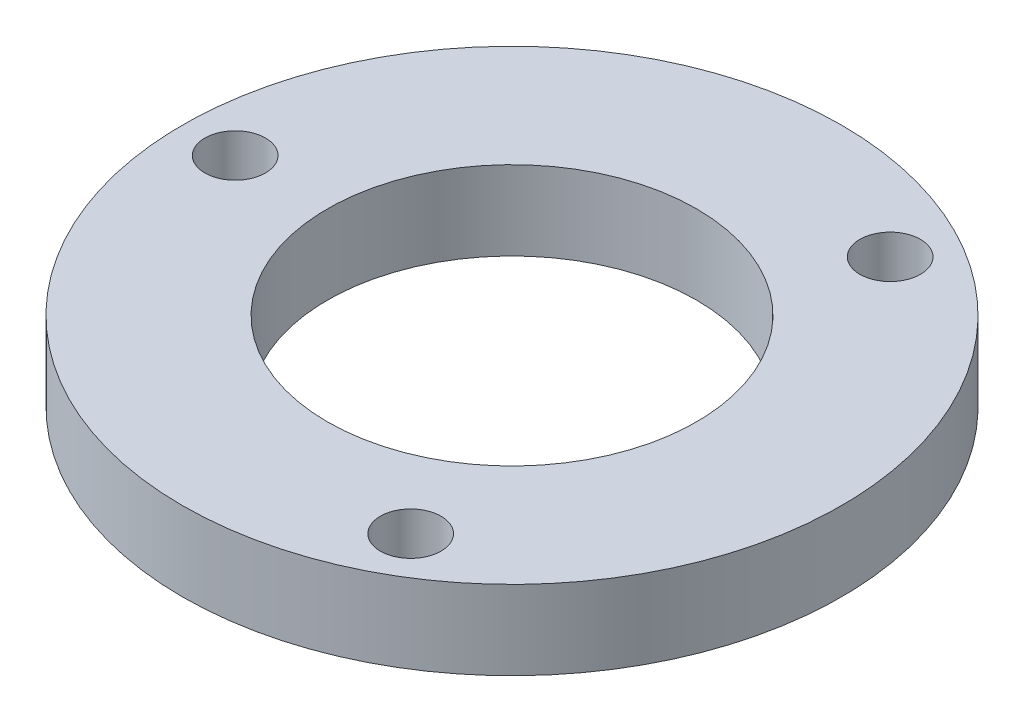
ISO-10303-21;
HEADER;
FILE_DESCRIPTION(('STEP AP214'),'2;1');
FILE_NAME('part.step','',(''),(''),'','','');
FILE_SCHEMA(('AUTOMOTIVE_DESIGN { 1 0 10303 214 1 1 1 1 }'));
ENDSEC;
DATA;
#1=APPLICATION_CONTEXT('core data for automotive mechanical design processes');
#2=APPLICATION_PROTOCOL_DEFINITION('international standard','automotive_design',2000,#1);
#3=PRODUCT_CONTEXT('',#1,'mechanical');
#4=PRODUCT('Part','Part','',(#3));
#5=PRODUCT_RELATED_PRODUCT_CATEGORY('part','',(#4));
#6=PRODUCT_DEFINITION_FORMATION('','',#4);
#7=PRODUCT_DEFINITION_CONTEXT('part definition',#1,'design');
#8=PRODUCT_DEFINITION('design','',#6,#7);
#9=PRODUCT_DEFINITION_SHAPE('','',#8);
#10=(LENGTH_UNIT() NAMED_UNIT(*) SI_UNIT(.MILLI.,.METRE.));
#11=(NAMED_UNIT(*) PLANE_ANGLE_UNIT() SI_UNIT($,.RADIAN.));
#12=(NAMED_UNIT(*) SI_UNIT($,.STERADIAN.) SOLID_ANGLE_UNIT());
#13=UNCERTAINTY_MEASURE_WITH_UNIT(LENGTH_MEASURE(1.E-05),#10,'distance_accuracy_value','');
#14=(GEOMETRIC_REPRESENTATION_CONTEXT(3) GLOBAL_UNCERTAINTY_ASSIGNED_CONTEXT((#13)) GLOBAL_UNIT_ASSIGNED_CONTEXT((#10,
#11,#12)) REPRESENTATION_CONTEXT('',''));
#15=CARTESIAN_POINT('',(0.,0.,0.));
#16=DIRECTION('',(0.,0.,1.));
#17=DIRECTION('',(1.,0.,0.));
#18=AXIS2_PLACEMENT_3D('',#15,#16,#17);
#19=CARTESIAN_POINT('',(0.,3.,0.));
#20=DIRECTION('',(0.,1.,0.));
#21=DIRECTION('',(0.,0.,1.));
#22=AXIS2_PLACEMENT_3D('',#19,#20,#21);
#23=PLANE('',#22);
#24=CARTESIAN_POINT('',(-10.5,3.,0.));
#25=DIRECTION('',(0.,1.,0.));
#26=DIRECTION('',(0.,0.,1.));
#27=AXIS2_PLACEMENT_3D('',#24,#25,#26);
#28=CIRCLE('',#27,1.15);
#29=CARTESIAN_POINT('',(-10.5,3.,1.15));
#30=VERTEX_POINT('',#29);
#31=EDGE_CURVE('E62',#30,#30,#28,.T.);
#32=ORIENTED_EDGE('',*,*,#31,.F.);
#33=EDGE_LOOP('',(#32));
#34=FACE_BOUND('',#33,.T.);
#35=CARTESIAN_POINT('',(5.25000000000004,3.,-9.09326673973658));
#36=DIRECTION('',(0.,1.,0.));
#37=DIRECTION('',(0.,0.,1.));
#38=AXIS2_PLACEMENT_3D('',#35,#36,#37);
#39=CIRCLE('',#38,1.15);
#40=CARTESIAN_POINT('',(5.25000000000004,3.,-7.94326673973659));
#41=VERTEX_POINT('',#40);
#42=EDGE_CURVE('E55',#41,#41,#39,.T.);
#43=ORIENTED_EDGE('',*,*,#42,.F.);
#44=EDGE_LOOP('',(#43));
#45=FACE_BOUND('',#44,.T.);
#46=CARTESIAN_POINT('',(5.24999999999992,3.,9.09326673973665));
#47=DIRECTION('',(0.,1.,0.));
#48=DIRECTION('',(0.,0.,1.));
#49=AXIS2_PLACEMENT_3D('',#46,#47,#48);
#50=CIRCLE('',#49,1.15);
#51=CARTESIAN_POINT('',(5.24999999999992,3.,10.2432667397367));
#52=VERTEX_POINT('',#51);
#53=EDGE_CURVE('E56',#52,#52,#50,.T.);
#54=ORIENTED_EDGE('',*,*,#53,.F.);
#55=EDGE_LOOP('',(#54));
#56=FACE_BOUND('',#55,.T.);
#57=CARTESIAN_POINT('',(0.,3.,0.));
#58=DIRECTION('',(0.,1.,0.));
#59=DIRECTION('',(0.,0.,1.));
#60=AXIS2_PLACEMENT_3D('',#57,#58,#59);
#61=CIRCLE('',#60,12.5);
#62=CARTESIAN_POINT('',(0.,3.,12.5));
#63=VERTEX_POINT('',#62);
#64=EDGE_CURVE('E10',#63,#63,#61,.T.);
#65=ORIENTED_EDGE('',*,*,#64,.T.);
#66=EDGE_LOOP('',(#65));
#67=FACE_BOUND('',#66,.T.);
#68=CARTESIAN_POINT('',(0.,3.,0.));
#69=DIRECTION('',(0.,1.,0.));
#70=DIRECTION('',(0.,0.,1.));
#71=AXIS2_PLACEMENT_3D('',#68,#69,#70);
#72=CIRCLE('',#71,7.);
#73=CARTESIAN_POINT('',(0.,3.,7.));
#74=VERTEX_POINT('',#73);
#75=EDGE_CURVE('E44',#74,#74,#72,.T.);
#76=ORIENTED_EDGE('',*,*,#75,.F.);
#77=EDGE_LOOP('',(#76));
#78=FACE_BOUND('',#77,.T.);
#79=ADVANCED_FACE('F33',(#34,#45,#56,#67,#78),#23,.T.);
#80=CARTESIAN_POINT('',(0.,0.,0.));
#81=DIRECTION('',(0.,1.,0.));
#82=DIRECTION('',(0.,0.,1.));
#83=AXIS2_PLACEMENT_3D('',#80,#81,#82);
#84=PLANE('',#83);
#85=CARTESIAN_POINT('',(-10.5,0.,0.));
#86=DIRECTION('',(0.,1.,0.));
#87=DIRECTION('',(0.,0.,1.));
#88=AXIS2_PLACEMENT_3D('',#85,#86,#87);
#89=CIRCLE('',#88,1.15);
#90=CARTESIAN_POINT('',(-10.5,0.,1.15));
#91=VERTEX_POINT('',#90);
#92=EDGE_CURVE('E49',#91,#91,#89,.F.);
#93=ORIENTED_EDGE('',*,*,#92,.F.);
#94=EDGE_LOOP('',(#93));
#95=FACE_BOUND('',#94,.T.);
#96=CARTESIAN_POINT('',(5.25000000000004,0.,-9.09326673973658));
#97=DIRECTION('',(0.,1.,0.));
#98=DIRECTION('',(0.,0.,1.));
#99=AXIS2_PLACEMENT_3D('',#96,#97,#98);
#100=CIRCLE('',#99,1.15);
#101=CARTESIAN_POINT('',(5.25000000000004,0.,-7.94326673973659));
#102=VERTEX_POINT('',#101);
#103=EDGE_CURVE('E59',#102,#102,#100,.F.);
#104=ORIENTED_EDGE('',*,*,#103,.F.);
#105=EDGE_LOOP('',(#104));
#106=FACE_BOUND('',#105,.T.);
#107=CARTESIAN_POINT('',(5.24999999999992,0.,9.09326673973665));
#108=DIRECTION('',(0.,1.,0.));
#109=DIRECTION('',(0.,0.,1.));
#110=AXIS2_PLACEMENT_3D('',#107,#108,#109);
#111=CIRCLE('',#110,1.15);
#112=CARTESIAN_POINT('',(5.24999999999992,0.,10.2432667397367));
#113=VERTEX_POINT('',#112);
#114=EDGE_CURVE('E52',#113,#113,#111,.F.);
#115=ORIENTED_EDGE('',*,*,#114,.F.);
#116=EDGE_LOOP('',(#115));
#117=FACE_BOUND('',#116,.T.);
#118=CARTESIAN_POINT('',(0.,0.,0.));
#119=DIRECTION('',(0.,1.,0.));
#120=DIRECTION('',(0.,0.,1.));
#121=AXIS2_PLACEMENT_3D('',#118,#119,#120);
#122=CIRCLE('',#121,12.5);
#123=CARTESIAN_POINT('',(0.,0.,12.5));
#124=VERTEX_POINT('',#123);
#125=EDGE_CURVE('E37',#124,#124,#122,.T.);
#126=ORIENTED_EDGE('',*,*,#125,.F.);
#127=EDGE_LOOP('',(#126));
#128=FACE_BOUND('',#127,.T.);
#129=CARTESIAN_POINT('',(0.,0.,0.));
#130=DIRECTION('',(0.,1.,0.));
#131=DIRECTION('',(0.,0.,1.));
#132=AXIS2_PLACEMENT_3D('',#129,#130,#131);
#133=CIRCLE('',#132,7.);
#134=CARTESIAN_POINT('',(0.,0.,7.));
#135=VERTEX_POINT('',#134);
#136=EDGE_CURVE('E46',#135,#135,#133,.T.);
#137=ORIENTED_EDGE('',*,*,#136,.T.);
#138=EDGE_LOOP('',(#137));
#139=FACE_BOUND('',#138,.T.);
#140=ADVANCED_FACE('F75',(#95,#106,#117,#128,#139),#84,.F.);
#141=CARTESIAN_POINT('',(0.,3.,0.));
#142=DIRECTION('',(0.,-1.,0.));
#143=DIRECTION('',(0.,0.,-1.));
#144=AXIS2_PLACEMENT_3D('',#141,#142,#143);
#145=CYLINDRICAL_SURFACE('',#144,12.5);
#146=ORIENTED_EDGE('',*,*,#64,.F.);
#147=EDGE_LOOP('',(#146));
#148=FACE_BOUND('',#147,.T.);
#149=ORIENTED_EDGE('',*,*,#125,.T.);
#150=EDGE_LOOP('',(#149));
#151=FACE_BOUND('',#150,.T.);
#152=ADVANCED_FACE('F35',(#148,#151),#145,.T.);
#153=CARTESIAN_POINT('',(0.,3.,0.));
#154=DIRECTION('',(0.,-1.,0.));
#155=DIRECTION('',(0.,0.,-1.));
#156=AXIS2_PLACEMENT_3D('',#153,#154,#155);
#157=CYLINDRICAL_SURFACE('',#156,7.);
#158=ORIENTED_EDGE('',*,*,#75,.T.);
#159=EDGE_LOOP('',(#158));
#160=FACE_BOUND('',#159,.T.);
#161=ORIENTED_EDGE('',*,*,#136,.F.);
#162=EDGE_LOOP('',(#161));
#163=FACE_BOUND('',#162,.T.);
#164=ADVANCED_FACE('F83',(#160,#163),#157,.F.);
#165=CARTESIAN_POINT('',(5.24999999999992,-0.00100000000000013,9.09326673973665));
#166=DIRECTION('',(0.,1.,0.));
#167=DIRECTION('',(0.,0.,1.));
#168=AXIS2_PLACEMENT_3D('',#165,#166,#167);
#169=CYLINDRICAL_SURFACE('',#168,1.15);
#170=CARTESIAN_POINT('',(5.24999999999992,3.,10.2432667397367));
#171=CARTESIAN_POINT('',(5.24999999999992,2.96875,10.2432667397367));
#172=CARTESIAN_POINT('',(5.24999999999992,2.9375,10.2432667397367));
#173=CARTESIAN_POINT('',(5.24999999999992,2.875,10.2432667397367));
#174=CARTESIAN_POINT('',(5.24999999999992,2.84375,10.2432667397367));
#175=CARTESIAN_POINT('',(5.24999999999992,2.78125,10.2432667397367));
#176=CARTESIAN_POINT('',(5.24999999999992,2.75,10.2432667397367));
#177=CARTESIAN_POINT('',(5.24999999999992,2.6875,10.2432667397367));
#178=CARTESIAN_POINT('',(5.24999999999992,2.65625,10.2432667397367));
#179=CARTESIAN_POINT('',(5.24999999999992,2.59375,10.2432667397367));
#180=CARTESIAN_POINT('',(5.24999999999992,2.5625,10.2432667397367));
#181=CARTESIAN_POINT('',(5.24999999999992,2.5,10.2432667397367));
#182=CARTESIAN_POINT('',(5.24999999999992,2.46875,10.2432667397367));
#183=CARTESIAN_POINT('',(5.24999999999992,2.40625,10.2432667397367));
#184=CARTESIAN_POINT('',(5.24999999999992,2.375,10.2432667397367));
#185=CARTESIAN_POINT('',(5.24999999999992,2.3125,10.2432667397367));
#186=CARTESIAN_POINT('',(5.24999999999992,2.28125,10.2432667397367));
#187=CARTESIAN_POINT('',(5.24999999999992,2.21875,10.2432667397367));
#188=CARTESIAN_POINT('',(5.24999999999992,2.1875,10.2432667397367));
#189=CARTESIAN_POINT('',(5.24999999999992,2.125,10.2432667397367));
#190=CARTESIAN_POINT('',(5.24999999999992,2.09375,10.2432667397367));
#191=CARTESIAN_POINT('',(5.24999999999992,2.03125,10.2432667397367));
#192=CARTESIAN_POINT('',(5.24999999999992,2.,10.2432667397367));
#193=CARTESIAN_POINT('',(5.24999999999992,1.9375,10.2432667397367));
#194=CARTESIAN_POINT('',(5.24999999999992,1.90625,10.2432667397367));
#195=CARTESIAN_POINT('',(5.24999999999992,1.84375,10.2432667397367));
#196=CARTESIAN_POINT('',(5.24999999999992,1.8125,10.2432667397367));
#197=CARTESIAN_POINT('',(5.24999999999992,1.75,10.2432667397367));
#198=CARTESIAN_POINT('',(5.24999999999992,1.71875,10.2432667397367));
#199=CARTESIAN_POINT('',(5.24999999999992,1.65625,10.2432667397367));
#200=CARTESIAN_POINT('',(5.24999999999992,1.625,10.2432667397367));
#201=CARTESIAN_POINT('',(5.24999999999992,1.5625,10.2432667397367));
#202=CARTESIAN_POINT('',(5.24999999999992,1.53125,10.2432667397367));
#203=CARTESIAN_POINT('',(5.24999999999992,1.46875,10.2432667397367));
#204=CARTESIAN_POINT('',(5.24999999999992,1.4375,10.2432667397367));
#205=CARTESIAN_POINT('',(5.24999999999992,1.375,10.2432667397367));
#206=CARTESIAN_POINT('',(5.24999999999992,1.34375,10.2432667397367));
#207=CARTESIAN_POINT('',(5.24999999999992,1.28125,10.2432667397367));
#208=CARTESIAN_POINT('',(5.24999999999992,1.25,10.2432667397367));
#209=CARTESIAN_POINT('',(5.24999999999992,1.1875,10.2432667397367));
#210=CARTESIAN_POINT('',(5.24999999999992,1.15625,10.2432667397367));
#211=CARTESIAN_POINT('',(5.24999999999992,1.09375,10.2432667397367));
#212=CARTESIAN_POINT('',(5.24999999999992,1.0625,10.2432667397367));
#213=CARTESIAN_POINT('',(5.24999999999992,1.,10.2432667397367));
#214=CARTESIAN_POINT('',(5.24999999999992,0.96875,10.2432667397367));
#215=CARTESIAN_POINT('',(5.24999999999992,0.90625,10.2432667397367));
#216=CARTESIAN_POINT('',(5.24999999999992,0.875,10.2432667397367));
#217=CARTESIAN_POINT('',(5.24999999999992,0.8125,10.2432667397367));
#218=CARTESIAN_POINT('',(5.24999999999992,0.78125,10.2432667397367));
#219=CARTESIAN_POINT('',(5.24999999999992,0.71875,10.2432667397367));
#220=CARTESIAN_POINT('',(5.24999999999992,0.6875,10.2432667397367));
#221=CARTESIAN_POINT('',(5.24999999999992,0.625,10.2432667397367));
#222=CARTESIAN_POINT('',(5.24999999999992,0.59375,10.2432667397367));
#223=CARTESIAN_POINT('',(5.24999999999992,0.53125,10.2432667397367));
#224=CARTESIAN_POINT('',(5.24999999999992,0.5,10.2432667397367));
#225=CARTESIAN_POINT('',(5.24999999999992,0.4375,10.2432667397367));
#226=CARTESIAN_POINT('',(5.24999999999992,0.40625,10.2432667397367));
#227=CARTESIAN_POINT('',(5.24999999999992,0.34375,10.2432667397367));
#228=CARTESIAN_POINT('',(5.24999999999992,0.3125,10.2432667397367));
#229=CARTESIAN_POINT('',(5.24999999999992,0.25,10.2432667397367));
#230=CARTESIAN_POINT('',(5.24999999999992,0.21875,10.2432667397367));
#231=CARTESIAN_POINT('',(5.24999999999992,0.15625,10.2432667397367));
#232=CARTESIAN_POINT('',(5.24999999999992,0.125,10.2432667397367));
#233=CARTESIAN_POINT('',(5.24999999999992,0.0625000000000001,10.2432667397367));
#234=CARTESIAN_POINT('',(5.24999999999992,0.0312500000000001,10.2432667397367));
#235=CARTESIAN_POINT('',(5.24999999999992,0.,10.2432667397367));
#236=B_SPLINE_CURVE_WITH_KNOTS('',3,(#170,#171,#172,#173,#174,#175,#176,#177,#178,#179,#180,
#181,#182,#183,#184,#185,#186,#187,#188,#189,#190,#191,#192,#193,#194,#195,#196,#197,#198,#199,
#200,#201,#202,#203,#204,#205,#206,#207,#208,#209,#210,#211,#212,#213,#214,#215,#216,#217,#218,
#219,#220,#221,#222,#223,#224,#225,#226,#227,#228,#229,#230,#231,#232,#233,#234,#235),
.UNSPECIFIED.,.F.,.F.,(4,2,2,2,2,2,2,2,2,2,2,2,2,2,2,2,2,2,2,2,2,2,2,2,2,2,2,2,2,2,2,2,4),(0.,
0.0937500000000001,0.1875,0.28125,0.375,0.46875,0.5625,0.65625,0.75,0.84375,0.9375,1.03125,
1.125,1.21875,1.3125,1.40625,1.5,1.59375,1.6875,1.78125,1.875,1.96875,2.0625,2.15625,2.25,
2.34375,2.4375,2.53125,2.625,2.71875,2.8125,2.90625,3.),.UNSPECIFIED.);
#237=EDGE_CURVE('BSEAM86',#52,#113,#236,.T.);
#238=ORIENTED_EDGE('',*,*,#53,.T.);
#239=ORIENTED_EDGE('',*,*,#114,.T.);
#240=ORIENTED_EDGE('',*,*,#237,.T.);
#241=ORIENTED_EDGE('',*,*,#237,.F.);
#242=EDGE_LOOP('',(#238,#240,#239,#241));
#243=FACE_BOUND('',#242,.T.);
#244=ADVANCED_FACE('F86',(#243),#169,.F.);
#245=CARTESIAN_POINT('',(5.25000000000004,-0.00100000000000013,-9.09326673973658));
#246=DIRECTION('',(0.,1.,0.));
#247=DIRECTION('',(0.,0.,1.));
#248=AXIS2_PLACEMENT_3D('',#245,#246,#247);
#249=CYLINDRICAL_SURFACE('',#248,1.15);
#250=CARTESIAN_POINT('',(5.25000000000004,3.,-7.94326673973659));
#251=CARTESIAN_POINT('',(5.25000000000004,2.96875,-7.94326673973659));
#252=CARTESIAN_POINT('',(5.25000000000004,2.9375,-7.94326673973659));
#253=CARTESIAN_POINT('',(5.25000000000004,2.875,-7.94326673973659));
#254=CARTESIAN_POINT('',(5.25000000000004,2.84375,-7.94326673973659));
#255=CARTESIAN_POINT('',(5.25000000000004,2.78125,-7.94326673973659));
#256=CARTESIAN_POINT('',(5.25000000000004,2.75,-7.94326673973659));
#257=CARTESIAN_POINT('',(5.25000000000004,2.6875,-7.94326673973659));
#258=CARTESIAN_POINT('',(5.25000000000004,2.65625,-7.94326673973659));
#259=CARTESIAN_POINT('',(5.25000000000004,2.59375,-7.94326673973659));
#260=CARTESIAN_POINT('',(5.25000000000004,2.5625,-7.94326673973659));
#261=CARTESIAN_POINT('',(5.25000000000004,2.5,-7.94326673973659));
#262=CARTESIAN_POINT('',(5.25000000000004,2.46875,-7.94326673973659));
#263=CARTESIAN_POINT('',(5.25000000000004,2.40625,-7.94326673973659));
#264=CARTESIAN_POINT('',(5.25000000000004,2.375,-7.94326673973659));
#265=CARTESIAN_POINT('',(5.25000000000004,2.3125,-7.94326673973659));
#266=CARTESIAN_POINT('',(5.25000000000004,2.28125,-7.94326673973659));
#267=CARTESIAN_POINT('',(5.25000000000004,2.21875,-7.94326673973659));
#268=CARTESIAN_POINT('',(5.25000000000004,2.1875,-7.94326673973659));
#269=CARTESIAN_POINT('',(5.25000000000004,2.125,-7.94326673973659));
#270=CARTESIAN_POINT('',(5.25000000000004,2.09375,-7.94326673973659));
#271=CARTESIAN_POINT('',(5.25000000000004,2.03125,-7.94326673973659));
#272=CARTESIAN_POINT('',(5.25000000000004,2.,-7.94326673973659));
#273=CARTESIAN_POINT('',(5.25000000000004,1.9375,-7.94326673973659));
#274=CARTESIAN_POINT('',(5.25000000000004,1.90625,-7.94326673973659));
#275=CARTESIAN_POINT('',(5.25000000000004,1.84375,-7.94326673973659));
#276=CARTESIAN_POINT('',(5.25000000000004,1.8125,-7.94326673973659));
#277=CARTESIAN_POINT('',(5.25000000000004,1.75,-7.94326673973659));
#278=CARTESIAN_POINT('',(5.25000000000004,1.71875,-7.94326673973659));
#279=CARTESIAN_POINT('',(5.25000000000004,1.65625,-7.94326673973659));
#280=CARTESIAN_POINT('',(5.25000000000004,1.625,-7.94326673973659));
#281=CARTESIAN_POINT('',(5.25000000000004,1.5625,-7.94326673973659));
#282=CARTESIAN_POINT('',(5.25000000000004,1.53125,-7.94326673973659));
#283=CARTESIAN_POINT('',(5.25000000000004,1.46875,-7.94326673973659));
#284=CARTESIAN_POINT('',(5.25000000000004,1.4375,-7.94326673973659));
#285=CARTESIAN_POINT('',(5.25000000000004,1.375,-7.94326673973659));
#286=CARTESIAN_POINT('',(5.25000000000004,1.34375,-7.94326673973659));
#287=CARTESIAN_POINT('',(5.25000000000004,1.28125,-7.94326673973659));
#288=CARTESIAN_POINT('',(5.25000000000004,1.25,-7.94326673973659));
#289=CARTESIAN_POINT('',(5.25000000000004,1.1875,-7.94326673973659));
#290=CARTESIAN_POINT('',(5.25000000000004,1.15625,-7.94326673973659));
#291=CARTESIAN_POINT('',(5.25000000000004,1.09375,-7.94326673973659));
#292=CARTESIAN_POINT('',(5.25000000000004,1.0625,-7.94326673973659));
#293=CARTESIAN_POINT('',(5.25000000000004,1.,-7.94326673973659));
#294=CARTESIAN_POINT('',(5.25000000000004,0.96875,-7.94326673973659));
#295=CARTESIAN_POINT('',(5.25000000000004,0.90625,-7.94326673973659));
#296=CARTESIAN_POINT('',(5.25000000000004,0.875,-7.94326673973659));
#297=CARTESIAN_POINT('',(5.25000000000004,0.8125,-7.94326673973659));
#298=CARTESIAN_POINT('',(5.25000000000004,0.78125,-7.94326673973659));
#299=CARTESIAN_POINT('',(5.25000000000004,0.71875,-7.94326673973659));
#300=CARTESIAN_POINT('',(5.25000000000004,0.6875,-7.94326673973659));
#301=CARTESIAN_POINT('',(5.25000000000004,0.625,-7.94326673973659));
#302=CARTESIAN_POINT('',(5.25000000000004,0.59375,-7.94326673973659));
#303=CARTESIAN_POINT('',(5.25000000000004,0.53125,-7.94326673973659));
#304=CARTESIAN_POINT('',(5.25000000000004,0.5,-7.94326673973659));
#305=CARTESIAN_POINT('',(5.25000000000004,0.4375,-7.94326673973659));
#306=CARTESIAN_POINT('',(5.25000000000004,0.40625,-7.94326673973659));
#307=CARTESIAN_POINT('',(5.25000000000004,0.34375,-7.94326673973659));
#308=CARTESIAN_POINT('',(5.25000000000004,0.3125,-7.94326673973659));
#309=CARTESIAN_POINT('',(5.25000000000004,0.25,-7.94326673973659));
#310=CARTESIAN_POINT('',(5.25000000000004,0.21875,-7.94326673973659));
#311=CARTESIAN_POINT('',(5.25000000000004,0.15625,-7.94326673973659));
#312=CARTESIAN_POINT('',(5.25000000000004,0.125,-7.94326673973659));
#313=CARTESIAN_POINT('',(5.25000000000004,0.0625000000000001,-7.94326673973659));
#314=CARTESIAN_POINT('',(5.25000000000004,0.0312500000000001,-7.94326673973659));
#315=CARTESIAN_POINT('',(5.25000000000004,0.,-7.94326673973659));
#316=B_SPLINE_CURVE_WITH_KNOTS('',3,(#250,#251,#252,#253,#254,#255,#256,#257,#258,#259,#260,
#261,#262,#263,#264,#265,#266,#267,#268,#269,#270,#271,#272,#273,#274,#275,#276,#277,#278,#279,
#280,#281,#282,#283,#284,#285,#286,#287,#288,#289,#290,#291,#292,#293,#294,#295,#296,#297,#298,
#299,#300,#301,#302,#303,#304,#305,#306,#307,#308,#309,#310,#311,#312,#313,#314,#315),
.UNSPECIFIED.,.F.,.F.,(4,2,2,2,2,2,2,2,2,2,2,2,2,2,2,2,2,2,2,2,2,2,2,2,2,2,2,2,2,2,2,2,4),(0.,
0.0937500000000001,0.1875,0.28125,0.375,0.46875,0.5625,0.65625,0.75,0.84375,0.9375,1.03125,
1.125,1.21875,1.3125,1.40625,1.5,1.59375,1.6875,1.78125,1.875,1.96875,2.0625,2.15625,2.25,
2.34375,2.4375,2.53125,2.625,2.71875,2.8125,2.90625,3.),.UNSPECIFIED.);
#317=EDGE_CURVE('BSEAM101',#41,#102,#316,.T.);
#318=ORIENTED_EDGE('',*,*,#42,.T.);
#319=ORIENTED_EDGE('',*,*,#103,.T.);
#320=ORIENTED_EDGE('',*,*,#317,.T.);
#321=ORIENTED_EDGE('',*,*,#317,.F.);
#322=EDGE_LOOP('',(#318,#320,#319,#321));
#323=FACE_BOUND('',#322,.T.);
#324=ADVANCED_FACE('F101',(#323),#249,.F.);
#325=CARTESIAN_POINT('',(-10.5,-0.00100000000000013,0.));
#326=DIRECTION('',(0.,1.,0.));
#327=DIRECTION('',(0.,0.,1.));
#328=AXIS2_PLACEMENT_3D('',#325,#326,#327);
#329=CYLINDRICAL_SURFACE('',#328,1.15);
#330=CARTESIAN_POINT('',(-10.5,3.,1.15));
#331=CARTESIAN_POINT('',(-10.5,2.96875,1.15));
#332=CARTESIAN_POINT('',(-10.5,2.9375,1.15));
#333=CARTESIAN_POINT('',(-10.5,2.875,1.15));
#334=CARTESIAN_POINT('',(-10.5,2.84375,1.15));
#335=CARTESIAN_POINT('',(-10.5,2.78125,1.15));
#336=CARTESIAN_POINT('',(-10.5,2.75,1.15));
#337=CARTESIAN_POINT('',(-10.5,2.6875,1.15));
#338=CARTESIAN_POINT('',(-10.5,2.65625,1.15));
#339=CARTESIAN_POINT('',(-10.5,2.59375,1.15));
#340=CARTESIAN_POINT('',(-10.5,2.5625,1.15));
#341=CARTESIAN_POINT('',(-10.5,2.5,1.15));
#342=CARTESIAN_POINT('',(-10.5,2.46875,1.15));
#343=CARTESIAN_POINT('',(-10.5,2.40625,1.15));
#344=CARTESIAN_POINT('',(-10.5,2.375,1.15));
#345=CARTESIAN_POINT('',(-10.5,2.3125,1.15));
#346=CARTESIAN_POINT('',(-10.5,2.28125,1.15));
#347=CARTESIAN_POINT('',(-10.5,2.21875,1.15));
#348=CARTESIAN_POINT('',(-10.5,2.1875,1.15));
#349=CARTESIAN_POINT('',(-10.5,2.125,1.15));
#350=CARTESIAN_POINT('',(-10.5,2.09375,1.15));
#351=CARTESIAN_POINT('',(-10.5,2.03125,1.15));
#352=CARTESIAN_POINT('',(-10.5,2.,1.15));
#353=CARTESIAN_POINT('',(-10.5,1.9375,1.15));
#354=CARTESIAN_POINT('',(-10.5,1.90625,1.15));
#355=CARTESIAN_POINT('',(-10.5,1.84375,1.15));
#356=CARTESIAN_POINT('',(-10.5,1.8125,1.15));
#357=CARTESIAN_POINT('',(-10.5,1.75,1.15));
#358=CARTESIAN_POINT('',(-10.5,1.71875,1.15));
#359=CARTESIAN_POINT('',(-10.5,1.65625,1.15));
#360=CARTESIAN_POINT('',(-10.5,1.625,1.15));
#361=CARTESIAN_POINT('',(-10.5,1.5625,1.15));
#362=CARTESIAN_POINT('',(-10.5,1.53125,1.15));
#363=CARTESIAN_POINT('',(-10.5,1.46875,1.15));
#364=CARTESIAN_POINT('',(-10.5,1.4375,1.15));
#365=CARTESIAN_POINT('',(-10.5,1.375,1.15));
#366=CARTESIAN_POINT('',(-10.5,1.34375,1.15));
#367=CARTESIAN_POINT('',(-10.5,1.28125,1.15));
#368=CARTESIAN_POINT('',(-10.5,1.25,1.15));
#369=CARTESIAN_POINT('',(-10.5,1.1875,1.15));
#370=CARTESIAN_POINT('',(-10.5,1.15625,1.15));
#371=CARTESIAN_POINT('',(-10.5,1.09375,1.15));
#372=CARTESIAN_POINT('',(-10.5,1.0625,1.15));
#373=CARTESIAN_POINT('',(-10.5,1.,1.15));
#374=CARTESIAN_POINT('',(-10.5,0.96875,1.15));
#375=CARTESIAN_POINT('',(-10.5,0.90625,1.15));
#376=CARTESIAN_POINT('',(-10.5,0.875,1.15));
#377=CARTESIAN_POINT('',(-10.5,0.8125,1.15));
#378=CARTESIAN_POINT('',(-10.5,0.78125,1.15));
#379=CARTESIAN_POINT('',(-10.5,0.71875,1.15));
#380=CARTESIAN_POINT('',(-10.5,0.6875,1.15));
#381=CARTESIAN_POINT('',(-10.5,0.625,1.15));
#382=CARTESIAN_POINT('',(-10.5,0.59375,1.15));
#383=CARTESIAN_POINT('',(-10.5,0.53125,1.15));
#384=CARTESIAN_POINT('',(-10.5,0.5,1.15));
#385=CARTESIAN_POINT('',(-10.5,0.4375,1.15));
#386=CARTESIAN_POINT('',(-10.5,0.40625,1.15));
#387=CARTESIAN_POINT('',(-10.5,0.34375,1.15));
#388=CARTESIAN_POINT('',(-10.5,0.3125,1.15));
#389=CARTESIAN_POINT('',(-10.5,0.25,1.15));
#390=CARTESIAN_POINT('',(-10.5,0.21875,1.15));
#391=CARTESIAN_POINT('',(-10.5,0.15625,1.15));
#392=CARTESIAN_POINT('',(-10.5,0.125,1.15));
#393=CARTESIAN_POINT('',(-10.5,0.0625000000000001,1.15));
#394=CARTESIAN_POINT('',(-10.5,0.0312500000000001,1.15));
#395=CARTESIAN_POINT('',(-10.5,0.,1.15));
#396=B_SPLINE_CURVE_WITH_KNOTS('',3,(#330,#331,#332,#333,#334,#335,#336,#337,#338,#339,#340,
#341,#342,#343,#344,#345,#346,#347,#348,#349,#350,#351,#352,#353,#354,#355,#356,#357,#358,#359,
#360,#361,#362,#363,#364,#365,#366,#367,#368,#369,#370,#371,#372,#373,#374,#375,#376,#377,#378,
#379,#380,#381,#382,#383,#384,#385,#386,#387,#388,#389,#390,#391,#392,#393,#394,#395),
.UNSPECIFIED.,.F.,.F.,(4,2,2,2,2,2,2,2,2,2,2,2,2,2,2,2,2,2,2,2,2,2,2,2,2,2,2,2,2,2,2,2,4),(0.,
0.0937500000000001,0.1875,0.28125,0.375,0.46875,0.5625,0.65625,0.75,0.84375,0.9375,1.03125,
1.125,1.21875,1.3125,1.40625,1.5,1.59375,1.6875,1.78125,1.875,1.96875,2.0625,2.15625,2.25,
2.34375,2.4375,2.53125,2.625,2.71875,2.8125,2.90625,3.),.UNSPECIFIED.);
#397=EDGE_CURVE('BSEAM70',#30,#91,#396,.T.);
#398=ORIENTED_EDGE('',*,*,#31,.T.);
#399=ORIENTED_EDGE('',*,*,#92,.T.);
#400=ORIENTED_EDGE('',*,*,#397,.T.);
#401=ORIENTED_EDGE('',*,*,#397,.F.);
#402=EDGE_LOOP('',(#398,#400,#399,#401));
#403=FACE_BOUND('',#402,.T.);
#404=ADVANCED_FACE('F70',(#403),#329,.F.);
#405=CLOSED_SHELL('',(#79,#140,#152,#164,#244,#324,#404));
#406=MANIFOLD_SOLID_BREP('B2',#405);
#407=ADVANCED_BREP_SHAPE_REPRESENTATION('',(#18,#406),#14);
#408=SHAPE_DEFINITION_REPRESENTATION(#9,#407);
ENDSEC;
END-ISO-10303-21;
